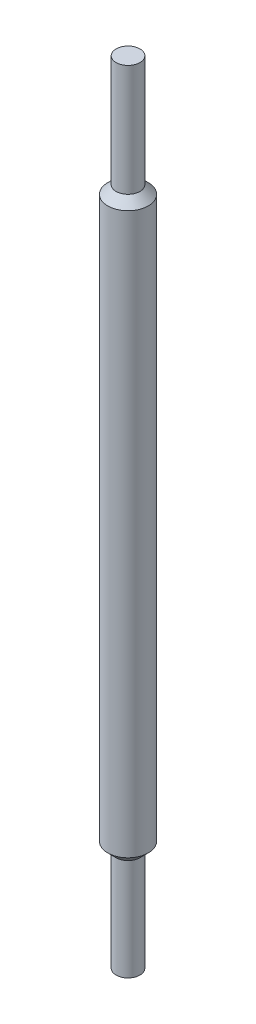
ISO-10303-21;
HEADER;
FILE_DESCRIPTION(('STEP AP214'),'2;1');
FILE_NAME('part.step','',(''),(''),'','','');
FILE_SCHEMA(('AUTOMOTIVE_DESIGN { 1 0 10303 214 1 1 1 1 }'));
ENDSEC;
DATA;
#1=APPLICATION_CONTEXT('core data for automotive mechanical design processes');
#2=APPLICATION_PROTOCOL_DEFINITION('international standard','automotive_design',2000,#1);
#3=PRODUCT_CONTEXT('',#1,'mechanical');
#4=PRODUCT('Part','Part','',(#3));
#5=PRODUCT_RELATED_PRODUCT_CATEGORY('part','',(#4));
#6=PRODUCT_DEFINITION_FORMATION('','',#4);
#7=PRODUCT_DEFINITION_CONTEXT('part definition',#1,'design');
#8=PRODUCT_DEFINITION('design','',#6,#7);
#9=PRODUCT_DEFINITION_SHAPE('','',#8);
#10=(LENGTH_UNIT() NAMED_UNIT(*) SI_UNIT(.MILLI.,.METRE.));
#11=(NAMED_UNIT(*) PLANE_ANGLE_UNIT() SI_UNIT($,.RADIAN.));
#12=(NAMED_UNIT(*) SI_UNIT($,.STERADIAN.) SOLID_ANGLE_UNIT());
#13=UNCERTAINTY_MEASURE_WITH_UNIT(LENGTH_MEASURE(1.E-05),#10,'distance_accuracy_value','');
#14=(GEOMETRIC_REPRESENTATION_CONTEXT(3) GLOBAL_UNCERTAINTY_ASSIGNED_CONTEXT((#13)) GLOBAL_UNIT_ASSIGNED_CONTEXT((#10,
#11,#12)) REPRESENTATION_CONTEXT('',''));
#15=CARTESIAN_POINT('',(0.,0.,0.));
#16=DIRECTION('',(0.,0.,1.));
#17=DIRECTION('',(1.,0.,0.));
#18=AXIS2_PLACEMENT_3D('',#15,#16,#17);
#19=CARTESIAN_POINT('',(0.,421.64,0.));
#20=DIRECTION('',(0.,-1.,0.));
#21=DIRECTION('',(0.,0.,-1.));
#22=AXIS2_PLACEMENT_3D('',#19,#20,#21);
#23=CYLINDRICAL_SURFACE('',#22,10.795);
#24=CARTESIAN_POINT('',(0.,357.632,0.));
#25=DIRECTION('',(0.,1.,0.));
#26=DIRECTION('',(0.,0.,1.));
#27=AXIS2_PLACEMENT_3D('',#24,#25,#26);
#28=CIRCLE('',#27,10.795);
#29=CARTESIAN_POINT('',(0.,357.632,10.795));
#30=VERTEX_POINT('',#29);
#31=EDGE_CURVE('E42',#30,#30,#28,.F.);
#32=ORIENTED_EDGE('',*,*,#31,.T.);
#33=EDGE_LOOP('',(#32));
#34=FACE_BOUND('',#33,.T.);
#35=CARTESIAN_POINT('',(0.,58.6740000000001,0.));
#36=DIRECTION('',(0.,-1.,0.));
#37=DIRECTION('',(0.,0.,-1.));
#38=AXIS2_PLACEMENT_3D('',#35,#36,#37);
#39=CIRCLE('',#38,10.795);
#40=CARTESIAN_POINT('',(0.,58.6740000000001,-10.795));
#41=VERTEX_POINT('',#40);
#42=EDGE_CURVE('E46',#41,#41,#39,.F.);
#43=ORIENTED_EDGE('',*,*,#42,.T.);
#44=EDGE_LOOP('',(#43));
#45=FACE_BOUND('',#44,.T.);
#46=ADVANCED_FACE('F31',(#34,#45),#23,.T.);
#47=CARTESIAN_POINT('',(0.,52.324,0.));
#48=DIRECTION('',(0.,-1.,0.));
#49=DIRECTION('',(0.,0.,-1.));
#50=AXIS2_PLACEMENT_3D('',#47,#48,#49);
#51=CYLINDRICAL_SURFACE('',#50,6.35);
#52=CARTESIAN_POINT('',(0.,54.2290000000001,0.));
#53=DIRECTION('',(0.,1.,0.));
#54=DIRECTION('',(0.,0.,1.));
#55=AXIS2_PLACEMENT_3D('',#52,#53,#54);
#56=CIRCLE('',#55,6.35);
#57=CARTESIAN_POINT('',(0.,54.2290000000001,6.35));
#58=VERTEX_POINT('',#57);
#59=EDGE_CURVE('E10',#58,#58,#56,.F.);
#60=ORIENTED_EDGE('',*,*,#59,.T.);
#61=EDGE_LOOP('',(#60));
#62=FACE_BOUND('',#61,.T.);
#63=CARTESIAN_POINT('',(0.,0.,0.));
#64=DIRECTION('',(0.,-1.,0.));
#65=DIRECTION('',(0.,0.,-1.));
#66=AXIS2_PLACEMENT_3D('',#63,#64,#65);
#67=CIRCLE('',#66,6.35);
#68=CARTESIAN_POINT('',(0.,0.,-6.35));
#69=VERTEX_POINT('',#68);
#70=EDGE_CURVE('E51',#69,#69,#67,.T.);
#71=ORIENTED_EDGE('',*,*,#70,.F.);
#72=EDGE_LOOP('',(#71));
#73=FACE_BOUND('',#72,.T.);
#74=ADVANCED_FACE('F70',(#62,#73),#51,.T.);
#75=CARTESIAN_POINT('',(0.,0.,0.));
#76=DIRECTION('',(0.,1.,0.));
#77=DIRECTION('',(0.,0.,1.));
#78=AXIS2_PLACEMENT_3D('',#75,#76,#77);
#79=PLANE('',#78);
#80=ORIENTED_EDGE('',*,*,#70,.T.);
#81=EDGE_LOOP('',(#80));
#82=FACE_BOUND('',#81,.T.);
#83=ADVANCED_FACE('F62',(#82),#79,.F.);
#84=CARTESIAN_POINT('',(0.,363.982,0.));
#85=DIRECTION('',(0.,1.,0.));
#86=DIRECTION('',(0.,0.,1.));
#87=AXIS2_PLACEMENT_3D('',#84,#85,#86);
#88=CYLINDRICAL_SURFACE('',#87,6.35);
#89=CARTESIAN_POINT('',(0.,362.077,0.));
#90=DIRECTION('',(0.,-1.,0.));
#91=DIRECTION('',(0.,0.,-1.));
#92=AXIS2_PLACEMENT_3D('',#89,#90,#91);
#93=CIRCLE('',#92,6.35);
#94=CARTESIAN_POINT('',(0.,362.077,6.35));
#95=VERTEX_POINT('',#94);
#96=EDGE_CURVE('E38',#95,#95,#93,.F.);
#97=CARTESIAN_POINT('',(0.,421.64,0.));
#98=DIRECTION('',(0.,1.,0.));
#99=DIRECTION('',(0.,0.,1.));
#100=AXIS2_PLACEMENT_3D('',#97,#98,#99);
#101=CIRCLE('',#100,6.35);
#102=CARTESIAN_POINT('',(0.,421.64,6.35));
#103=VERTEX_POINT('',#102);
#104=EDGE_CURVE('E54',#103,#103,#101,.T.);
#105=CARTESIAN_POINT('',(0.,362.077,6.35));
#106=CARTESIAN_POINT('',(0.,362.697447916667,6.35));
#107=CARTESIAN_POINT('',(0.,363.317895833333,6.35));
#108=CARTESIAN_POINT('',(0.,364.558791666667,6.35));
#109=CARTESIAN_POINT('',(0.,365.179239583333,6.35));
#110=CARTESIAN_POINT('',(0.,366.420135416667,6.35));
#111=CARTESIAN_POINT('',(0.,367.040583333333,6.35));
#112=CARTESIAN_POINT('',(0.,368.281479166667,6.35));
#113=CARTESIAN_POINT('',(0.,368.901927083333,6.35));
#114=CARTESIAN_POINT('',(0.,370.142822916667,6.35));
#115=CARTESIAN_POINT('',(0.,370.763270833333,6.35));
#116=CARTESIAN_POINT('',(0.,372.004166666667,6.35));
#117=CARTESIAN_POINT('',(0.,372.624614583333,6.35));
#118=CARTESIAN_POINT('',(0.,373.865510416667,6.35));
#119=CARTESIAN_POINT('',(0.,374.485958333333,6.35));
#120=CARTESIAN_POINT('',(0.,375.726854166667,6.35));
#121=CARTESIAN_POINT('',(0.,376.347302083333,6.35));
#122=CARTESIAN_POINT('',(0.,377.588197916667,6.35));
#123=CARTESIAN_POINT('',(0.,378.208645833333,6.35));
#124=CARTESIAN_POINT('',(0.,379.449541666667,6.35));
#125=CARTESIAN_POINT('',(0.,380.069989583333,6.35));
#126=CARTESIAN_POINT('',(0.,381.310885416667,6.35));
#127=CARTESIAN_POINT('',(0.,381.931333333333,6.35));
#128=CARTESIAN_POINT('',(0.,383.172229166667,6.35));
#129=CARTESIAN_POINT('',(0.,383.792677083333,6.35));
#130=CARTESIAN_POINT('',(0.,385.033572916667,6.35));
#131=CARTESIAN_POINT('',(0.,385.654020833333,6.35));
#132=CARTESIAN_POINT('',(0.,386.894916666667,6.35));
#133=CARTESIAN_POINT('',(0.,387.515364583333,6.35));
#134=CARTESIAN_POINT('',(0.,388.756260416667,6.35));
#135=CARTESIAN_POINT('',(0.,389.376708333333,6.35));
#136=CARTESIAN_POINT('',(0.,390.617604166667,6.35));
#137=CARTESIAN_POINT('',(0.,391.238052083333,6.35));
#138=CARTESIAN_POINT('',(0.,392.478947916667,6.35));
#139=CARTESIAN_POINT('',(0.,393.099395833333,6.35));
#140=CARTESIAN_POINT('',(0.,394.340291666667,6.35));
#141=CARTESIAN_POINT('',(0.,394.960739583333,6.35));
#142=CARTESIAN_POINT('',(0.,396.201635416667,6.35));
#143=CARTESIAN_POINT('',(0.,396.822083333333,6.35));
#144=CARTESIAN_POINT('',(0.,398.062979166667,6.35));
#145=CARTESIAN_POINT('',(0.,398.683427083333,6.35));
#146=CARTESIAN_POINT('',(0.,399.924322916667,6.35));
#147=CARTESIAN_POINT('',(0.,400.544770833333,6.35));
#148=CARTESIAN_POINT('',(0.,401.785666666667,6.35));
#149=CARTESIAN_POINT('',(0.,402.406114583333,6.35));
#150=CARTESIAN_POINT('',(0.,403.647010416667,6.35));
#151=CARTESIAN_POINT('',(0.,404.267458333333,6.35));
#152=CARTESIAN_POINT('',(0.,405.508354166667,6.35));
#153=CARTESIAN_POINT('',(0.,406.128802083333,6.35));
#154=CARTESIAN_POINT('',(0.,407.369697916667,6.35));
#155=CARTESIAN_POINT('',(0.,407.990145833333,6.35));
#156=CARTESIAN_POINT('',(0.,409.231041666667,6.35));
#157=CARTESIAN_POINT('',(0.,409.851489583333,6.35));
#158=CARTESIAN_POINT('',(0.,411.092385416667,6.35));
#159=CARTESIAN_POINT('',(0.,411.712833333333,6.35));
#160=CARTESIAN_POINT('',(0.,412.953729166667,6.35));
#161=CARTESIAN_POINT('',(0.,413.574177083333,6.35));
#162=CARTESIAN_POINT('',(0.,414.815072916667,6.35));
#163=CARTESIAN_POINT('',(0.,415.435520833333,6.35));
#164=CARTESIAN_POINT('',(0.,416.676416666667,6.35));
#165=CARTESIAN_POINT('',(0.,417.296864583333,6.35));
#166=CARTESIAN_POINT('',(0.,418.537760416667,6.35));
#167=CARTESIAN_POINT('',(0.,419.158208333333,6.35));
#168=CARTESIAN_POINT('',(0.,420.399104166667,6.35));
#169=CARTESIAN_POINT('',(0.,421.019552083333,6.35));
#170=CARTESIAN_POINT('',(0.,421.64,6.35));
#171=B_SPLINE_CURVE_WITH_KNOTS('',3,(#105,#106,#107,#108,#109,#110,#111,#112,#113,#114,#115,
#116,#117,#118,#119,#120,#121,#122,#123,#124,#125,#126,#127,#128,#129,#130,#131,#132,#133,#134,
#135,#136,#137,#138,#139,#140,#141,#142,#143,#144,#145,#146,#147,#148,#149,#150,#151,#152,#153,
#154,#155,#156,#157,#158,#159,#160,#161,#162,#163,#164,#165,#166,#167,#168,#169,#170),
.UNSPECIFIED.,.F.,.F.,(4,2,2,2,2,2,2,2,2,2,2,2,2,2,2,2,2,2,2,2,2,2,2,2,2,2,2,2,2,2,2,2,4),(0.,
1.86134374999997,3.72268749999999,5.58403124999995,7.44537499999998,9.30671874999994,11.1680625,
13.02940625,14.89075,16.75209375,18.6134374999999,20.47478125,22.336125,24.1974687499999,
26.0588125,27.9201562499999,29.7815,31.64284375,33.5041875,35.36553125,37.2268749999999,
39.08821875,40.9495624999999,42.8109062499999,44.67225,46.5335937499999,48.3949375,
50.2562812499999,52.1176249999999,53.97896875,55.8403124999999,57.70165625,59.5629999999999),.UNSPECIFIED.);
#172=EDGE_CURVE('BSEAM60',#95,#103,#171,.T.);
#173=ORIENTED_EDGE('',*,*,#96,.T.);
#174=ORIENTED_EDGE('',*,*,#104,.F.);
#175=ORIENTED_EDGE('',*,*,#172,.T.);
#176=ORIENTED_EDGE('',*,*,#172,.F.);
#177=EDGE_LOOP('',(#173,#175,#174,#176));
#178=FACE_BOUND('',#177,.T.);
#179=ADVANCED_FACE('F60',(#178),#88,.T.);
#180=CARTESIAN_POINT('',(0.,421.64,0.));
#181=DIRECTION('',(0.,1.,0.));
#182=DIRECTION('',(0.,0.,1.));
#183=AXIS2_PLACEMENT_3D('',#180,#181,#182);
#184=PLANE('',#183);
#185=ORIENTED_EDGE('',*,*,#104,.T.);
#186=EDGE_LOOP('',(#185));
#187=FACE_BOUND('',#186,.T.);
#188=ADVANCED_FACE('F58',(#187),#184,.T.);
#189=CARTESIAN_POINT('',(0.,357.632,0.));
#190=DIRECTION('',(0.,-1.,0.));
#191=DIRECTION('',(0.,0.,-1.));
#192=AXIS2_PLACEMENT_3D('',#189,#190,#191);
#193=CONICAL_SURFACE('',#192,10.795,0.785398163397441);
#194=ORIENTED_EDGE('',*,*,#96,.F.);
#195=EDGE_LOOP('',(#194));
#196=FACE_BOUND('',#195,.T.);
#197=ORIENTED_EDGE('',*,*,#31,.F.);
#198=EDGE_LOOP('',(#197));
#199=FACE_BOUND('',#198,.T.);
#200=ADVANCED_FACE('F68',(#196,#199),#193,.T.);
#201=CARTESIAN_POINT('',(0.,58.6740000000001,0.));
#202=DIRECTION('',(0.,1.,0.));
#203=DIRECTION('',(0.,0.,1.));
#204=AXIS2_PLACEMENT_3D('',#201,#202,#203);
#205=CONICAL_SURFACE('',#204,10.795,0.785398163397451);
#206=ORIENTED_EDGE('',*,*,#59,.F.);
#207=EDGE_LOOP('',(#206));
#208=FACE_BOUND('',#207,.T.);
#209=ORIENTED_EDGE('',*,*,#42,.F.);
#210=EDGE_LOOP('',(#209));
#211=FACE_BOUND('',#210,.T.);
#212=ADVANCED_FACE('F33',(#208,#211),#205,.T.);
#213=CLOSED_SHELL('',(#46,#74,#83,#179,#188,#200,#212));
#214=MANIFOLD_SOLID_BREP('B2',#213);
#215=ADVANCED_BREP_SHAPE_REPRESENTATION('',(#18,#214),#14);
#216=SHAPE_DEFINITION_REPRESENTATION(#9,#215);
ENDSEC;
END-ISO-10303-21;
